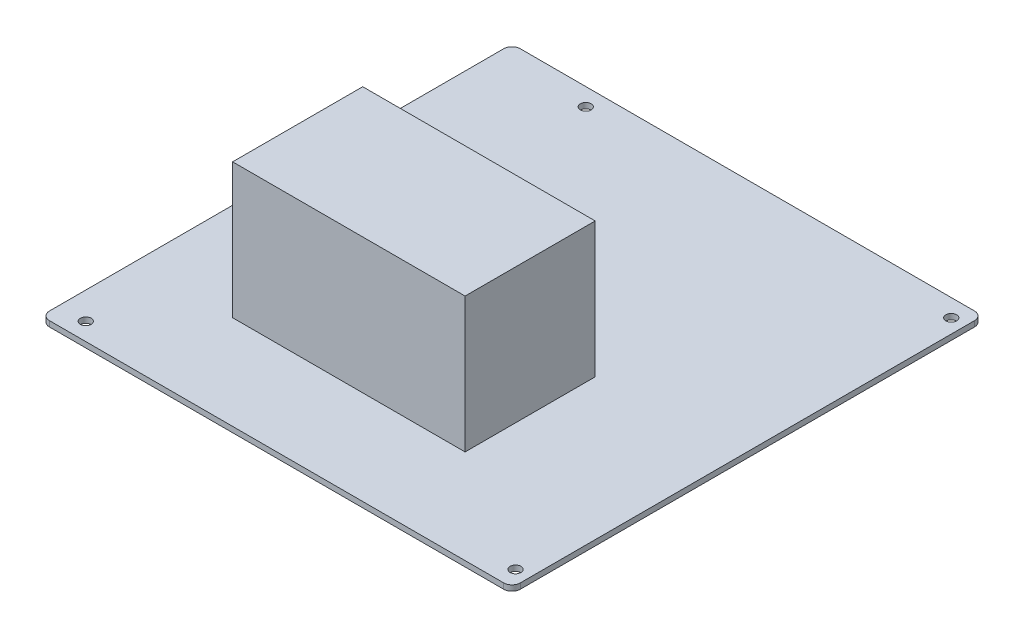
ISO-10303-21;
HEADER;
FILE_DESCRIPTION(('STEP AP214'),'2;1');
FILE_NAME('part.step','',(''),(''),'','','');
FILE_SCHEMA(('AUTOMOTIVE_DESIGN { 1 0 10303 214 1 1 1 1 }'));
ENDSEC;
DATA;
#1=APPLICATION_CONTEXT('core data for automotive mechanical design processes');
#2=APPLICATION_PROTOCOL_DEFINITION('international standard','automotive_design',2000,#1);
#3=PRODUCT_CONTEXT('',#1,'mechanical');
#4=PRODUCT('Part','Part','',(#3));
#5=PRODUCT_RELATED_PRODUCT_CATEGORY('part','',(#4));
#6=PRODUCT_DEFINITION_FORMATION('','',#4);
#7=PRODUCT_DEFINITION_CONTEXT('part definition',#1,'design');
#8=PRODUCT_DEFINITION('design','',#6,#7);
#9=PRODUCT_DEFINITION_SHAPE('','',#8);
#10=(LENGTH_UNIT() NAMED_UNIT(*) SI_UNIT(.MILLI.,.METRE.));
#11=(NAMED_UNIT(*) PLANE_ANGLE_UNIT() SI_UNIT($,.RADIAN.));
#12=(NAMED_UNIT(*) SI_UNIT($,.STERADIAN.) SOLID_ANGLE_UNIT());
#13=UNCERTAINTY_MEASURE_WITH_UNIT(LENGTH_MEASURE(1.E-05),#10,'distance_accuracy_value','');
#14=(GEOMETRIC_REPRESENTATION_CONTEXT(3) GLOBAL_UNCERTAINTY_ASSIGNED_CONTEXT((#13)) GLOBAL_UNIT_ASSIGNED_CONTEXT((#10,
#11,#12)) REPRESENTATION_CONTEXT('',''));
#15=CARTESIAN_POINT('',(0.,0.,0.));
#16=DIRECTION('',(0.,0.,1.));
#17=DIRECTION('',(1.,0.,0.));
#18=AXIS2_PLACEMENT_3D('',#15,#16,#17);
#19=CARTESIAN_POINT('',(0.,2.,0.));
#20=DIRECTION('',(0.,-1.,0.));
#21=DIRECTION('',(0.,0.,-1.));
#22=AXIS2_PLACEMENT_3D('',#19,#20,#21);
#23=PLANE('',#22);
#24=CARTESIAN_POINT('',(-75.29,2.,78.7400000000001));
#25=DIRECTION('',(0.,1.,0.));
#26=DIRECTION('',(0.,0.,1.));
#27=AXIS2_PLACEMENT_3D('',#24,#25,#26);
#28=CIRCLE('',#27,1.94999999999999);
#29=CARTESIAN_POINT('',(-75.29,2.,80.69));
#30=VERTEX_POINT('',#29);
#31=EDGE_CURVE('E443',#30,#30,#28,.T.);
#32=ORIENTED_EDGE('',*,*,#31,.F.);
#33=EDGE_LOOP('',(#32));
#34=FACE_BOUND('',#33,.T.);
#35=CARTESIAN_POINT('',(80.01,2.,78.7400000000001));
#36=DIRECTION('',(0.,1.,0.));
#37=DIRECTION('',(0.,0.,1.));
#38=AXIS2_PLACEMENT_3D('',#35,#36,#37);
#39=CIRCLE('',#38,1.94999999999999);
#40=CARTESIAN_POINT('',(80.01,2.,80.69));
#41=VERTEX_POINT('',#40);
#42=EDGE_CURVE('E438',#41,#41,#39,.T.);
#43=ORIENTED_EDGE('',*,*,#42,.F.);
#44=EDGE_LOOP('',(#43));
#45=FACE_BOUND('',#44,.T.);
#46=CARTESIAN_POINT('',(80.01,2.,-78.7399999999999));
#47=DIRECTION('',(0.,1.,0.));
#48=DIRECTION('',(0.,0.,1.));
#49=AXIS2_PLACEMENT_3D('',#46,#47,#48);
#50=CIRCLE('',#49,1.94999999999999);
#51=CARTESIAN_POINT('',(80.01,2.,-76.7899999999999));
#52=VERTEX_POINT('',#51);
#53=EDGE_CURVE('E432',#52,#52,#50,.T.);
#54=ORIENTED_EDGE('',*,*,#53,.F.);
#55=EDGE_LOOP('',(#54));
#56=FACE_BOUND('',#55,.T.);
#57=CARTESIAN_POINT('',(-52.07,2.,-78.7399999999999));
#58=DIRECTION('',(0.,1.,0.));
#59=DIRECTION('',(0.,0.,1.));
#60=AXIS2_PLACEMENT_3D('',#57,#58,#59);
#61=CIRCLE('',#60,1.95);
#62=CARTESIAN_POINT('',(-52.07,2.,-76.7899999999999));
#63=VERTEX_POINT('',#62);
#64=EDGE_CURVE('E426',#63,#63,#61,.T.);
#65=ORIENTED_EDGE('',*,*,#64,.F.);
#66=EDGE_LOOP('',(#65));
#67=FACE_BOUND('',#66,.T.);
#68=DIRECTION('',(-1.,0.,0.));
#69=VECTOR('',#68,1.);
#70=CARTESIAN_POINT('',(85.09,2.,-85.09));
#71=LINE('',#70,#69);
#72=CARTESIAN_POINT('',(82.09,2.,-85.09));
#73=VERTEX_POINT('',#72);
#74=CARTESIAN_POINT('',(-82.09,2.,-85.09));
#75=VERTEX_POINT('',#74);
#76=EDGE_CURVE('E168',#73,#75,#71,.T.);
#77=ORIENTED_EDGE('',*,*,#76,.T.);
#78=CARTESIAN_POINT('',(-82.09,2.,-82.09));
#79=DIRECTION('',(0.,-1.,0.));
#80=DIRECTION('',(0.,0.,-1.));
#81=AXIS2_PLACEMENT_3D('',#78,#79,#80);
#82=CIRCLE('',#81,3.);
#83=CARTESIAN_POINT('',(-85.09,2.,-82.09));
#84=VERTEX_POINT('',#83);
#85=EDGE_CURVE('E200',#75,#84,#82,.F.);
#86=ORIENTED_EDGE('',*,*,#85,.T.);
#87=DIRECTION('',(0.,0.,1.));
#88=VECTOR('',#87,1.);
#89=CARTESIAN_POINT('',(-85.09,2.,-85.09));
#90=LINE('',#89,#88);
#91=CARTESIAN_POINT('',(-85.09,2.,82.09));
#92=VERTEX_POINT('',#91);
#93=EDGE_CURVE('E160',#84,#92,#90,.T.);
#94=ORIENTED_EDGE('',*,*,#93,.T.);
#95=CARTESIAN_POINT('',(-82.09,2.,82.09));
#96=DIRECTION('',(0.,-1.,0.));
#97=DIRECTION('',(0.,0.,-1.));
#98=AXIS2_PLACEMENT_3D('',#95,#96,#97);
#99=CIRCLE('',#98,3.);
#100=CARTESIAN_POINT('',(-82.09,2.,85.09));
#101=VERTEX_POINT('',#100);
#102=EDGE_CURVE('E195',#92,#101,#99,.F.);
#103=ORIENTED_EDGE('',*,*,#102,.T.);
#104=DIRECTION('',(1.,0.,0.));
#105=VECTOR('',#104,1.);
#106=CARTESIAN_POINT('',(85.09,2.,85.09));
#107=LINE('',#106,#105);
#108=CARTESIAN_POINT('',(82.09,2.,85.09));
#109=VERTEX_POINT('',#108);
#110=EDGE_CURVE('E163',#101,#109,#107,.T.);
#111=ORIENTED_EDGE('',*,*,#110,.T.);
#112=CARTESIAN_POINT('',(82.09,2.,82.09));
#113=DIRECTION('',(0.,-1.,0.));
#114=DIRECTION('',(0.,0.,-1.));
#115=AXIS2_PLACEMENT_3D('',#112,#113,#114);
#116=CIRCLE('',#115,3.);
#117=CARTESIAN_POINT('',(85.09,2.,82.09));
#118=VERTEX_POINT('',#117);
#119=EDGE_CURVE('E58',#109,#118,#116,.F.);
#120=ORIENTED_EDGE('',*,*,#119,.T.);
#121=DIRECTION('',(0.,0.,-1.));
#122=VECTOR('',#121,1.);
#123=CARTESIAN_POINT('',(85.09,2.,-85.09));
#124=LINE('',#123,#122);
#125=CARTESIAN_POINT('',(85.09,2.,-82.09));
#126=VERTEX_POINT('',#125);
#127=EDGE_CURVE('E166',#118,#126,#124,.T.);
#128=ORIENTED_EDGE('',*,*,#127,.T.);
#129=CARTESIAN_POINT('',(82.09,2.,-82.09));
#130=DIRECTION('',(0.,-1.,0.));
#131=DIRECTION('',(0.,0.,-1.));
#132=AXIS2_PLACEMENT_3D('',#129,#130,#131);
#133=CIRCLE('',#132,3.);
#134=EDGE_CURVE('E198',#126,#73,#133,.F.);
#135=ORIENTED_EDGE('',*,*,#134,.T.);
#136=EDGE_LOOP('',(#77,#86,#94,#103,#111,#120,#128,#135));
#137=FACE_BOUND('',#136,.T.);
#138=DIRECTION('',(0.,0.,-1.));
#139=VECTOR('',#138,1.);
#140=CARTESIAN_POINT('',(34.1365223784535,2.,4.06941648218151));
#141=LINE('',#140,#139);
#142=CARTESIAN_POINT('',(34.1365223784535,2.,51.088179300379));
#143=VERTEX_POINT('',#142);
#144=CARTESIAN_POINT('',(34.1365223784535,2.,4.06941648218151));
#145=VERTEX_POINT('',#144);
#146=EDGE_CURVE('E150',#143,#145,#141,.T.);
#147=ORIENTED_EDGE('',*,*,#146,.F.);
#148=DIRECTION('',(1.,0.,0.));
#149=VECTOR('',#148,1.);
#150=CARTESIAN_POINT('',(-49.8792163491686,2.,51.088179300379));
#151=LINE('',#150,#149);
#152=CARTESIAN_POINT('',(-49.8792163491686,2.,51.088179300379));
#153=VERTEX_POINT('',#152);
#154=EDGE_CURVE('E147',#153,#143,#151,.T.);
#155=ORIENTED_EDGE('',*,*,#154,.F.);
#156=DIRECTION('',(0.,0.,1.));
#157=VECTOR('',#156,1.);
#158=CARTESIAN_POINT('',(-49.8792163491686,2.,4.06941648218151));
#159=LINE('',#158,#157);
#160=CARTESIAN_POINT('',(-49.8792163491686,2.,4.06941648218151));
#161=VERTEX_POINT('',#160);
#162=EDGE_CURVE('E410',#161,#153,#159,.T.);
#163=ORIENTED_EDGE('',*,*,#162,.F.);
#164=DIRECTION('',(-1.,0.,0.));
#165=VECTOR('',#164,1.);
#166=CARTESIAN_POINT('',(-49.8792163491686,2.,4.06941648218151));
#167=LINE('',#166,#165);
#168=EDGE_CURVE('E412',#145,#161,#167,.T.);
#169=ORIENTED_EDGE('',*,*,#168,.F.);
#170=EDGE_LOOP('',(#147,#155,#163,#169));
#171=FACE_BOUND('',#170,.T.);
#172=ADVANCED_FACE('F36',(#34,#45,#56,#67,#137,#171),#23,.F.);
#173=CARTESIAN_POINT('',(-85.09,2.,-85.09));
#174=DIRECTION('',(1.,0.,0.));
#175=DIRECTION('',(0.,0.,-1.));
#176=AXIS2_PLACEMENT_3D('',#173,#174,#175);
#177=PLANE('',#176);
#178=ORIENTED_EDGE('',*,*,#93,.F.);
#179=DIRECTION('',(0.,-1.,0.));
#180=VECTOR('',#179,1.);
#181=CARTESIAN_POINT('',(-85.09,2.,-82.09));
#182=LINE('',#181,#180);
#183=CARTESIAN_POINT('',(-85.09,0.,-82.09));
#184=VERTEX_POINT('',#183);
#185=EDGE_CURVE('E179',#84,#184,#182,.T.);
#186=ORIENTED_EDGE('',*,*,#185,.T.);
#187=DIRECTION('',(0.,0.,1.));
#188=VECTOR('',#187,1.);
#189=CARTESIAN_POINT('',(-85.09,0.,-85.09));
#190=LINE('',#189,#188);
#191=CARTESIAN_POINT('',(-85.09,0.,82.09));
#192=VERTEX_POINT('',#191);
#193=EDGE_CURVE('E151',#184,#192,#190,.T.);
#194=ORIENTED_EDGE('',*,*,#193,.T.);
#195=DIRECTION('',(0.,-1.,0.));
#196=VECTOR('',#195,1.);
#197=CARTESIAN_POINT('',(-85.09,2.,82.09));
#198=LINE('',#197,#196);
#199=EDGE_CURVE('E170',#192,#92,#198,.F.);
#200=ORIENTED_EDGE('',*,*,#199,.T.);
#201=EDGE_LOOP('',(#178,#186,#194,#200));
#202=FACE_BOUND('',#201,.T.);
#203=ADVANCED_FACE('F238',(#202),#177,.F.);
#204=CARTESIAN_POINT('',(85.09,2.,85.09));
#205=DIRECTION('',(0.,0.,-1.));
#206=DIRECTION('',(-1.,0.,0.));
#207=AXIS2_PLACEMENT_3D('',#204,#205,#206);
#208=PLANE('',#207);
#209=DIRECTION('',(1.,0.,0.));
#210=VECTOR('',#209,1.);
#211=CARTESIAN_POINT('',(85.09,0.,85.09));
#212=LINE('',#211,#210);
#213=CARTESIAN_POINT('',(-82.09,0.,85.09));
#214=VERTEX_POINT('',#213);
#215=CARTESIAN_POINT('',(82.09,0.,85.09));
#216=VERTEX_POINT('',#215);
#217=EDGE_CURVE('E154',#214,#216,#212,.T.);
#218=ORIENTED_EDGE('',*,*,#217,.T.);
#219=DIRECTION('',(0.,-1.,0.));
#220=VECTOR('',#219,1.);
#221=CARTESIAN_POINT('',(82.09,2.,85.09));
#222=LINE('',#221,#220);
#223=EDGE_CURVE('E11',#216,#109,#222,.F.);
#224=ORIENTED_EDGE('',*,*,#223,.T.);
#225=ORIENTED_EDGE('',*,*,#110,.F.);
#226=DIRECTION('',(0.,-1.,0.));
#227=VECTOR('',#226,1.);
#228=CARTESIAN_POINT('',(-82.09,2.,85.09));
#229=LINE('',#228,#227);
#230=EDGE_CURVE('E44',#101,#214,#229,.T.);
#231=ORIENTED_EDGE('',*,*,#230,.T.);
#232=EDGE_LOOP('',(#218,#224,#225,#231));
#233=FACE_BOUND('',#232,.T.);
#234=ADVANCED_FACE('F210',(#233),#208,.F.);
#235=CARTESIAN_POINT('',(85.09,2.,-85.09));
#236=DIRECTION('',(-1.,0.,0.));
#237=DIRECTION('',(0.,0.,1.));
#238=AXIS2_PLACEMENT_3D('',#235,#236,#237);
#239=PLANE('',#238);
#240=DIRECTION('',(0.,0.,-1.));
#241=VECTOR('',#240,1.);
#242=CARTESIAN_POINT('',(85.09,0.,-85.09));
#243=LINE('',#242,#241);
#244=CARTESIAN_POINT('',(85.09,0.,82.09));
#245=VERTEX_POINT('',#244);
#246=CARTESIAN_POINT('',(85.09,0.,-82.09));
#247=VERTEX_POINT('',#246);
#248=EDGE_CURVE('E174',#245,#247,#243,.T.);
#249=ORIENTED_EDGE('',*,*,#248,.T.);
#250=DIRECTION('',(0.,-1.,0.));
#251=VECTOR('',#250,1.);
#252=CARTESIAN_POINT('',(85.09,2.,-82.09));
#253=LINE('',#252,#251);
#254=EDGE_CURVE('E51',#247,#126,#253,.F.);
#255=ORIENTED_EDGE('',*,*,#254,.T.);
#256=ORIENTED_EDGE('',*,*,#127,.F.);
#257=DIRECTION('',(0.,-1.,0.));
#258=VECTOR('',#257,1.);
#259=CARTESIAN_POINT('',(85.09,2.,82.09));
#260=LINE('',#259,#258);
#261=EDGE_CURVE('E202',#118,#245,#260,.T.);
#262=ORIENTED_EDGE('',*,*,#261,.T.);
#263=EDGE_LOOP('',(#249,#255,#256,#262));
#264=FACE_BOUND('',#263,.T.);
#265=ADVANCED_FACE('F221',(#264),#239,.F.);
#266=CARTESIAN_POINT('',(85.09,2.,-85.09));
#267=DIRECTION('',(0.,0.,1.));
#268=DIRECTION('',(1.,0.,0.));
#269=AXIS2_PLACEMENT_3D('',#266,#267,#268);
#270=PLANE('',#269);
#271=DIRECTION('',(-1.,0.,0.));
#272=VECTOR('',#271,1.);
#273=CARTESIAN_POINT('',(85.09,0.,-85.09));
#274=LINE('',#273,#272);
#275=CARTESIAN_POINT('',(82.09,0.,-85.09));
#276=VERTEX_POINT('',#275);
#277=CARTESIAN_POINT('',(-82.09,0.,-85.09));
#278=VERTEX_POINT('',#277);
#279=EDGE_CURVE('E164',#276,#278,#274,.T.);
#280=ORIENTED_EDGE('',*,*,#279,.T.);
#281=DIRECTION('',(0.,-1.,0.));
#282=VECTOR('',#281,1.);
#283=CARTESIAN_POINT('',(-82.09,2.,-85.09));
#284=LINE('',#283,#282);
#285=EDGE_CURVE('E193',#278,#75,#284,.F.);
#286=ORIENTED_EDGE('',*,*,#285,.T.);
#287=ORIENTED_EDGE('',*,*,#76,.F.);
#288=DIRECTION('',(0.,-1.,0.));
#289=VECTOR('',#288,1.);
#290=CARTESIAN_POINT('',(82.09,2.,-85.09));
#291=LINE('',#290,#289);
#292=EDGE_CURVE('E190',#73,#276,#291,.T.);
#293=ORIENTED_EDGE('',*,*,#292,.T.);
#294=EDGE_LOOP('',(#280,#286,#287,#293));
#295=FACE_BOUND('',#294,.T.);
#296=ADVANCED_FACE('F230',(#295),#270,.F.);
#297=CARTESIAN_POINT('',(0.,0.,0.));
#298=DIRECTION('',(0.,-1.,0.));
#299=DIRECTION('',(0.,0.,-1.));
#300=AXIS2_PLACEMENT_3D('',#297,#298,#299);
#301=PLANE('',#300);
#302=CARTESIAN_POINT('',(-75.29,0.,78.7400000000001));
#303=DIRECTION('',(0.,-1.,0.));
#304=DIRECTION('',(0.,0.,-1.));
#305=AXIS2_PLACEMENT_3D('',#302,#303,#304);
#306=CIRCLE('',#305,1.94999999999999);
#307=CARTESIAN_POINT('',(-75.29,0.,76.79));
#308=VERTEX_POINT('',#307);
#309=EDGE_CURVE('E441',#308,#308,#306,.T.);
#310=ORIENTED_EDGE('',*,*,#309,.F.);
#311=EDGE_LOOP('',(#310));
#312=FACE_BOUND('',#311,.T.);
#313=CARTESIAN_POINT('',(80.01,0.,78.7400000000001));
#314=DIRECTION('',(0.,-1.,0.));
#315=DIRECTION('',(0.,0.,-1.));
#316=AXIS2_PLACEMENT_3D('',#313,#314,#315);
#317=CIRCLE('',#316,1.94999999999999);
#318=CARTESIAN_POINT('',(80.01,0.,76.79));
#319=VERTEX_POINT('',#318);
#320=EDGE_CURVE('E435',#319,#319,#317,.T.);
#321=ORIENTED_EDGE('',*,*,#320,.F.);
#322=EDGE_LOOP('',(#321));
#323=FACE_BOUND('',#322,.T.);
#324=CARTESIAN_POINT('',(80.01,0.,-78.7399999999999));
#325=DIRECTION('',(0.,-1.,0.));
#326=DIRECTION('',(0.,0.,-1.));
#327=AXIS2_PLACEMENT_3D('',#324,#325,#326);
#328=CIRCLE('',#327,1.94999999999999);
#329=CARTESIAN_POINT('',(80.01,0.,-80.6899999999999));
#330=VERTEX_POINT('',#329);
#331=EDGE_CURVE('E429',#330,#330,#328,.T.);
#332=ORIENTED_EDGE('',*,*,#331,.F.);
#333=EDGE_LOOP('',(#332));
#334=FACE_BOUND('',#333,.T.);
#335=CARTESIAN_POINT('',(-52.07,0.,-78.7399999999999));
#336=DIRECTION('',(0.,-1.,0.));
#337=DIRECTION('',(0.,0.,-1.));
#338=AXIS2_PLACEMENT_3D('',#335,#336,#337);
#339=CIRCLE('',#338,1.95);
#340=CARTESIAN_POINT('',(-52.07,0.,-80.6899999999999));
#341=VERTEX_POINT('',#340);
#342=EDGE_CURVE('E421',#341,#341,#339,.T.);
#343=ORIENTED_EDGE('',*,*,#342,.F.);
#344=EDGE_LOOP('',(#343));
#345=FACE_BOUND('',#344,.T.);
#346=ORIENTED_EDGE('',*,*,#193,.F.);
#347=CARTESIAN_POINT('',(-82.09,0.,-82.09));
#348=DIRECTION('',(0.,-1.,0.));
#349=DIRECTION('',(0.,0.,-1.));
#350=AXIS2_PLACEMENT_3D('',#347,#348,#349);
#351=CIRCLE('',#350,3.);
#352=EDGE_CURVE('E188',#184,#278,#351,.T.);
#353=ORIENTED_EDGE('',*,*,#352,.T.);
#354=ORIENTED_EDGE('',*,*,#279,.F.);
#355=CARTESIAN_POINT('',(82.09,0.,-82.09));
#356=DIRECTION('',(0.,-1.,0.));
#357=DIRECTION('',(0.,0.,-1.));
#358=AXIS2_PLACEMENT_3D('',#355,#356,#357);
#359=CIRCLE('',#358,3.);
#360=EDGE_CURVE('E186',#276,#247,#359,.T.);
#361=ORIENTED_EDGE('',*,*,#360,.T.);
#362=ORIENTED_EDGE('',*,*,#248,.F.);
#363=CARTESIAN_POINT('',(82.09,0.,82.09));
#364=DIRECTION('',(0.,-1.,0.));
#365=DIRECTION('',(0.,0.,-1.));
#366=AXIS2_PLACEMENT_3D('',#363,#364,#365);
#367=CIRCLE('',#366,3.);
#368=EDGE_CURVE('E184',#245,#216,#367,.T.);
#369=ORIENTED_EDGE('',*,*,#368,.T.);
#370=ORIENTED_EDGE('',*,*,#217,.F.);
#371=CARTESIAN_POINT('',(-82.09,0.,82.09));
#372=DIRECTION('',(0.,-1.,0.));
#373=DIRECTION('',(0.,0.,-1.));
#374=AXIS2_PLACEMENT_3D('',#371,#372,#373);
#375=CIRCLE('',#374,3.);
#376=EDGE_CURVE('E182',#214,#192,#375,.T.);
#377=ORIENTED_EDGE('',*,*,#376,.T.);
#378=EDGE_LOOP('',(#346,#353,#354,#361,#362,#369,#370,#377));
#379=FACE_BOUND('',#378,.T.);
#380=ADVANCED_FACE('F216',(#312,#323,#334,#345,#379),#301,.T.);
#381=CARTESIAN_POINT('',(34.1365223784535,50.8,4.06941648218151));
#382=DIRECTION('',(-1.,0.,0.));
#383=DIRECTION('',(0.,0.,1.));
#384=AXIS2_PLACEMENT_3D('',#381,#382,#383);
#385=PLANE('',#384);
#386=ORIENTED_EDGE('',*,*,#146,.T.);
#387=DIRECTION('',(0.,-1.,0.));
#388=VECTOR('',#387,1.);
#389=CARTESIAN_POINT('',(34.1365223784535,50.8,4.06941648218151));
#390=LINE('',#389,#388);
#391=CARTESIAN_POINT('',(34.1365223784535,50.8,4.06941648218151));
#392=VERTEX_POINT('',#391);
#393=EDGE_CURVE('E131',#392,#145,#390,.T.);
#394=ORIENTED_EDGE('',*,*,#393,.F.);
#395=DIRECTION('',(0.,0.,-1.));
#396=VECTOR('',#395,1.);
#397=CARTESIAN_POINT('',(34.1365223784535,50.8,4.06941648218151));
#398=LINE('',#397,#396);
#399=CARTESIAN_POINT('',(34.1365223784535,50.8,51.088179300379));
#400=VERTEX_POINT('',#399);
#401=EDGE_CURVE('E138',#400,#392,#398,.T.);
#402=ORIENTED_EDGE('',*,*,#401,.F.);
#403=DIRECTION('',(0.,-1.,0.));
#404=VECTOR('',#403,1.);
#405=CARTESIAN_POINT('',(34.1365223784535,50.8,51.088179300379));
#406=LINE('',#405,#404);
#407=EDGE_CURVE('E415',#400,#143,#406,.T.);
#408=ORIENTED_EDGE('',*,*,#407,.T.);
#409=EDGE_LOOP('',(#386,#394,#402,#408));
#410=FACE_BOUND('',#409,.T.);
#411=ADVANCED_FACE('F149',(#410),#385,.F.);
#412=CARTESIAN_POINT('',(-49.8792163491686,50.8,4.06941648218151));
#413=DIRECTION('',(0.,0.,1.));
#414=DIRECTION('',(1.,0.,0.));
#415=AXIS2_PLACEMENT_3D('',#412,#413,#414);
#416=PLANE('',#415);
#417=ORIENTED_EDGE('',*,*,#168,.T.);
#418=DIRECTION('',(0.,-1.,0.));
#419=VECTOR('',#418,1.);
#420=CARTESIAN_POINT('',(-49.8792163491686,50.8,4.06941648218151));
#421=LINE('',#420,#419);
#422=CARTESIAN_POINT('',(-49.8792163491686,50.8,4.06941648218151));
#423=VERTEX_POINT('',#422);
#424=EDGE_CURVE('E134',#423,#161,#421,.T.);
#425=ORIENTED_EDGE('',*,*,#424,.F.);
#426=DIRECTION('',(-1.,0.,0.));
#427=VECTOR('',#426,1.);
#428=CARTESIAN_POINT('',(-49.8792163491686,50.8,4.06941648218151));
#429=LINE('',#428,#427);
#430=EDGE_CURVE('E126',#392,#423,#429,.T.);
#431=ORIENTED_EDGE('',*,*,#430,.F.);
#432=ORIENTED_EDGE('',*,*,#393,.T.);
#433=EDGE_LOOP('',(#417,#425,#431,#432));
#434=FACE_BOUND('',#433,.T.);
#435=ADVANCED_FACE('F129',(#434),#416,.F.);
#436=CARTESIAN_POINT('',(-49.8792163491686,50.8,4.06941648218151));
#437=DIRECTION('',(1.,0.,0.));
#438=DIRECTION('',(0.,0.,-1.));
#439=AXIS2_PLACEMENT_3D('',#436,#437,#438);
#440=PLANE('',#439);
#441=ORIENTED_EDGE('',*,*,#162,.T.);
#442=DIRECTION('',(0.,-1.,0.));
#443=VECTOR('',#442,1.);
#444=CARTESIAN_POINT('',(-49.8792163491686,50.8,51.088179300379));
#445=LINE('',#444,#443);
#446=CARTESIAN_POINT('',(-49.8792163491686,50.8,51.088179300379));
#447=VERTEX_POINT('',#446);
#448=EDGE_CURVE('E156',#447,#153,#445,.T.);
#449=ORIENTED_EDGE('',*,*,#448,.F.);
#450=DIRECTION('',(0.,0.,1.));
#451=VECTOR('',#450,1.);
#452=CARTESIAN_POINT('',(-49.8792163491686,50.8,4.06941648218151));
#453=LINE('',#452,#451);
#454=EDGE_CURVE('E137',#423,#447,#453,.T.);
#455=ORIENTED_EDGE('',*,*,#454,.F.);
#456=ORIENTED_EDGE('',*,*,#424,.T.);
#457=EDGE_LOOP('',(#441,#449,#455,#456));
#458=FACE_BOUND('',#457,.T.);
#459=ADVANCED_FACE('F345',(#458),#440,.F.);
#460=CARTESIAN_POINT('',(-49.8792163491686,50.8,51.088179300379));
#461=DIRECTION('',(0.,0.,-1.));
#462=DIRECTION('',(-1.,0.,0.));
#463=AXIS2_PLACEMENT_3D('',#460,#461,#462);
#464=PLANE('',#463);
#465=ORIENTED_EDGE('',*,*,#154,.T.);
#466=ORIENTED_EDGE('',*,*,#407,.F.);
#467=DIRECTION('',(1.,0.,0.));
#468=VECTOR('',#467,1.);
#469=CARTESIAN_POINT('',(-49.8792163491686,50.8,51.088179300379));
#470=LINE('',#469,#468);
#471=EDGE_CURVE('E143',#447,#400,#470,.T.);
#472=ORIENTED_EDGE('',*,*,#471,.F.);
#473=ORIENTED_EDGE('',*,*,#448,.T.);
#474=EDGE_LOOP('',(#465,#466,#472,#473));
#475=FACE_BOUND('',#474,.T.);
#476=ADVANCED_FACE('F342',(#475),#464,.F.);
#477=CARTESIAN_POINT('',(0.,50.8,0.));
#478=DIRECTION('',(0.,1.,0.));
#479=DIRECTION('',(0.,0.,1.));
#480=AXIS2_PLACEMENT_3D('',#477,#478,#479);
#481=PLANE('',#480);
#482=ORIENTED_EDGE('',*,*,#401,.T.);
#483=ORIENTED_EDGE('',*,*,#430,.T.);
#484=ORIENTED_EDGE('',*,*,#454,.T.);
#485=ORIENTED_EDGE('',*,*,#471,.T.);
#486=EDGE_LOOP('',(#482,#483,#484,#485));
#487=FACE_BOUND('',#486,.T.);
#488=ADVANCED_FACE('F141',(#487),#481,.T.);
#489=CARTESIAN_POINT('',(-82.09,2.,-82.09));
#490=DIRECTION('',(0.,-1.,0.));
#491=DIRECTION('',(0.,0.,-1.));
#492=AXIS2_PLACEMENT_3D('',#489,#490,#491);
#493=CYLINDRICAL_SURFACE('',#492,3.);
#494=ORIENTED_EDGE('',*,*,#85,.F.);
#495=ORIENTED_EDGE('',*,*,#285,.F.);
#496=ORIENTED_EDGE('',*,*,#352,.F.);
#497=ORIENTED_EDGE('',*,*,#185,.F.);
#498=EDGE_LOOP('',(#494,#495,#496,#497));
#499=FACE_BOUND('',#498,.T.);
#500=ADVANCED_FACE('F235',(#499),#493,.T.);
#501=CARTESIAN_POINT('',(82.09,2.,-82.09));
#502=DIRECTION('',(0.,-1.,0.));
#503=DIRECTION('',(0.,0.,-1.));
#504=AXIS2_PLACEMENT_3D('',#501,#502,#503);
#505=CYLINDRICAL_SURFACE('',#504,3.);
#506=ORIENTED_EDGE('',*,*,#134,.F.);
#507=ORIENTED_EDGE('',*,*,#254,.F.);
#508=ORIENTED_EDGE('',*,*,#360,.F.);
#509=ORIENTED_EDGE('',*,*,#292,.F.);
#510=EDGE_LOOP('',(#506,#507,#508,#509));
#511=FACE_BOUND('',#510,.T.);
#512=ADVANCED_FACE('F227',(#511),#505,.T.);
#513=CARTESIAN_POINT('',(82.09,2.,82.09));
#514=DIRECTION('',(0.,-1.,0.));
#515=DIRECTION('',(0.,0.,-1.));
#516=AXIS2_PLACEMENT_3D('',#513,#514,#515);
#517=CYLINDRICAL_SURFACE('',#516,3.);
#518=ORIENTED_EDGE('',*,*,#119,.F.);
#519=ORIENTED_EDGE('',*,*,#223,.F.);
#520=ORIENTED_EDGE('',*,*,#368,.F.);
#521=ORIENTED_EDGE('',*,*,#261,.F.);
#522=EDGE_LOOP('',(#518,#519,#520,#521));
#523=FACE_BOUND('',#522,.T.);
#524=ADVANCED_FACE('F220',(#523),#517,.T.);
#525=CARTESIAN_POINT('',(-82.09,2.,82.09));
#526=DIRECTION('',(0.,-1.,0.));
#527=DIRECTION('',(0.,0.,-1.));
#528=AXIS2_PLACEMENT_3D('',#525,#526,#527);
#529=CYLINDRICAL_SURFACE('',#528,3.);
#530=ORIENTED_EDGE('',*,*,#102,.F.);
#531=ORIENTED_EDGE('',*,*,#199,.F.);
#532=ORIENTED_EDGE('',*,*,#376,.F.);
#533=ORIENTED_EDGE('',*,*,#230,.F.);
#534=EDGE_LOOP('',(#530,#531,#532,#533));
#535=FACE_BOUND('',#534,.T.);
#536=ADVANCED_FACE('F38',(#535),#529,.T.);
#537=CARTESIAN_POINT('',(-52.07,2.,-78.7399999999999));
#538=DIRECTION('',(0.,1.,0.));
#539=DIRECTION('',(0.,0.,1.));
#540=AXIS2_PLACEMENT_3D('',#537,#538,#539);
#541=CYLINDRICAL_SURFACE('',#540,1.95);
#542=ORIENTED_EDGE('',*,*,#342,.T.);
#543=EDGE_LOOP('',(#542));
#544=FACE_BOUND('',#543,.T.);
#545=ORIENTED_EDGE('',*,*,#64,.T.);
#546=EDGE_LOOP('',(#545));
#547=FACE_BOUND('',#546,.T.);
#548=ADVANCED_FACE('F241',(#544,#547),#541,.F.);
#549=CARTESIAN_POINT('',(80.01,2.,-78.7399999999999));
#550=DIRECTION('',(0.,1.,0.));
#551=DIRECTION('',(0.,0.,1.));
#552=AXIS2_PLACEMENT_3D('',#549,#550,#551);
#553=CYLINDRICAL_SURFACE('',#552,1.94999999999999);
#554=ORIENTED_EDGE('',*,*,#331,.T.);
#555=EDGE_LOOP('',(#554));
#556=FACE_BOUND('',#555,.T.);
#557=ORIENTED_EDGE('',*,*,#53,.T.);
#558=EDGE_LOOP('',(#557));
#559=FACE_BOUND('',#558,.T.);
#560=ADVANCED_FACE('F246',(#556,#559),#553,.F.);
#561=CARTESIAN_POINT('',(80.01,2.,78.7400000000001));
#562=DIRECTION('',(0.,1.,0.));
#563=DIRECTION('',(0.,0.,1.));
#564=AXIS2_PLACEMENT_3D('',#561,#562,#563);
#565=CYLINDRICAL_SURFACE('',#564,1.94999999999999);
#566=ORIENTED_EDGE('',*,*,#320,.T.);
#567=EDGE_LOOP('',(#566));
#568=FACE_BOUND('',#567,.T.);
#569=ORIENTED_EDGE('',*,*,#42,.T.);
#570=EDGE_LOOP('',(#569));
#571=FACE_BOUND('',#570,.T.);
#572=ADVANCED_FACE('F314',(#568,#571),#565,.F.);
#573=CARTESIAN_POINT('',(-75.29,2.,78.7400000000001));
#574=DIRECTION('',(0.,1.,0.));
#575=DIRECTION('',(0.,0.,1.));
#576=AXIS2_PLACEMENT_3D('',#573,#574,#575);
#577=CYLINDRICAL_SURFACE('',#576,1.94999999999999);
#578=ORIENTED_EDGE('',*,*,#309,.T.);
#579=EDGE_LOOP('',(#578));
#580=FACE_BOUND('',#579,.T.);
#581=ORIENTED_EDGE('',*,*,#31,.T.);
#582=EDGE_LOOP('',(#581));
#583=FACE_BOUND('',#582,.T.);
#584=ADVANCED_FACE('F324',(#580,#583),#577,.F.);
#585=CLOSED_SHELL('',(#172,#203,#234,#265,#296,#380,#411,#435,#459,#476,#488,#500,#512,#524,
#536,#548,#560,#572,#584));
#586=MANIFOLD_SOLID_BREP('B2',#585);
#587=ADVANCED_BREP_SHAPE_REPRESENTATION('',(#18,#586),#14);
#588=SHAPE_DEFINITION_REPRESENTATION(#9,#587);
ENDSEC;
END-ISO-10303-21;
